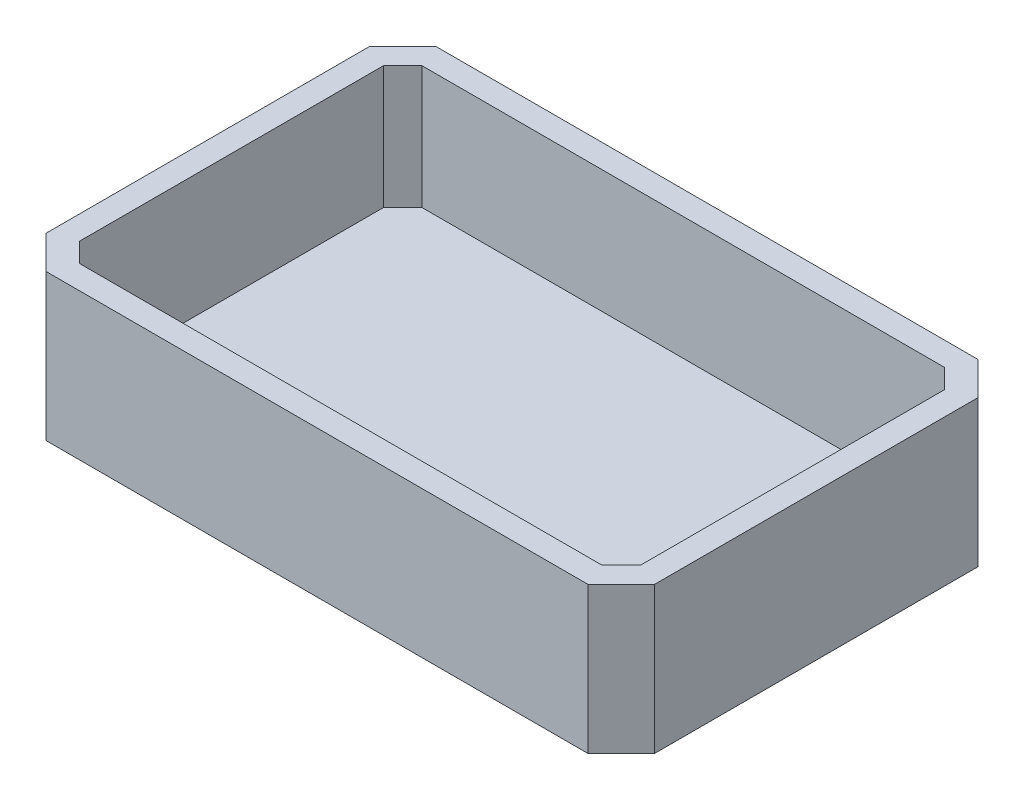
ISO-10303-21;
HEADER;
FILE_DESCRIPTION(('STEP AP214'),'2;1');
FILE_NAME('part.step','',(''),(''),'','','');
FILE_SCHEMA(('AUTOMOTIVE_DESIGN { 1 0 10303 214 1 1 1 1 }'));
ENDSEC;
DATA;
#1=APPLICATION_CONTEXT('core data for automotive mechanical design processes');
#2=APPLICATION_PROTOCOL_DEFINITION('international standard','automotive_design',2000,#1);
#3=PRODUCT_CONTEXT('',#1,'mechanical');
#4=PRODUCT('Part','Part','',(#3));
#5=PRODUCT_RELATED_PRODUCT_CATEGORY('part','',(#4));
#6=PRODUCT_DEFINITION_FORMATION('','',#4);
#7=PRODUCT_DEFINITION_CONTEXT('part definition',#1,'design');
#8=PRODUCT_DEFINITION('design','',#6,#7);
#9=PRODUCT_DEFINITION_SHAPE('','',#8);
#10=(LENGTH_UNIT() NAMED_UNIT(*) SI_UNIT(.MILLI.,.METRE.));
#11=(NAMED_UNIT(*) PLANE_ANGLE_UNIT() SI_UNIT($,.RADIAN.));
#12=(NAMED_UNIT(*) SI_UNIT($,.STERADIAN.) SOLID_ANGLE_UNIT());
#13=UNCERTAINTY_MEASURE_WITH_UNIT(LENGTH_MEASURE(1.E-05),#10,'distance_accuracy_value','');
#14=(GEOMETRIC_REPRESENTATION_CONTEXT(3) GLOBAL_UNCERTAINTY_ASSIGNED_CONTEXT((#13)) GLOBAL_UNIT_ASSIGNED_CONTEXT((#10,
#11,#12)) REPRESENTATION_CONTEXT('',''));
#15=CARTESIAN_POINT('',(0.,0.,0.));
#16=DIRECTION('',(0.,0.,1.));
#17=DIRECTION('',(1.,0.,0.));
#18=AXIS2_PLACEMENT_3D('',#15,#16,#17);
#19=CARTESIAN_POINT('',(0.,124.,0.));
#20=DIRECTION('',(0.,-1.,0.));
#21=DIRECTION('',(0.,0.,-1.));
#22=AXIS2_PLACEMENT_3D('',#19,#20,#21);
#23=PLANE('',#22);
#24=DIRECTION('',(1.,0.,0.));
#25=VECTOR('',#24,1.);
#26=CARTESIAN_POINT('',(-257.5,124.,165.));
#27=LINE('',#26,#25);
#28=CARTESIAN_POINT('',(-229.5,124.,165.));
#29=VERTEX_POINT('',#28);
#30=CARTESIAN_POINT('',(229.5,124.,165.));
#31=VERTEX_POINT('',#30);
#32=EDGE_CURVE('E214',#29,#31,#27,.T.);
#33=ORIENTED_EDGE('',*,*,#32,.T.);
#34=DIRECTION('',(-0.70710678118655,0.,0.707106781186545));
#35=VECTOR('',#34,1.);
#36=CARTESIAN_POINT('',(257.5,124.,137.));
#37=LINE('',#36,#35);
#38=CARTESIAN_POINT('',(257.5,124.,137.));
#39=VERTEX_POINT('',#38);
#40=EDGE_CURVE('E252',#31,#39,#37,.F.);
#41=ORIENTED_EDGE('',*,*,#40,.T.);
#42=DIRECTION('',(0.,0.,-1.));
#43=VECTOR('',#42,1.);
#44=CARTESIAN_POINT('',(257.5,124.,165.));
#45=LINE('',#44,#43);
#46=CARTESIAN_POINT('',(257.5,124.,-137.));
#47=VERTEX_POINT('',#46);
#48=EDGE_CURVE('E205',#39,#47,#45,.T.);
#49=ORIENTED_EDGE('',*,*,#48,.T.);
#50=DIRECTION('',(0.707106781186546,0.,0.707106781186549));
#51=VECTOR('',#50,1.);
#52=CARTESIAN_POINT('',(229.5,124.,-165.));
#53=LINE('',#52,#51);
#54=CARTESIAN_POINT('',(229.5,124.,-165.));
#55=VERTEX_POINT('',#54);
#56=EDGE_CURVE('E250',#47,#55,#53,.F.);
#57=ORIENTED_EDGE('',*,*,#56,.T.);
#58=DIRECTION('',(-1.,0.,0.));
#59=VECTOR('',#58,1.);
#60=CARTESIAN_POINT('',(-257.5,124.,-165.));
#61=LINE('',#60,#59);
#62=CARTESIAN_POINT('',(-229.5,124.,-165.));
#63=VERTEX_POINT('',#62);
#64=EDGE_CURVE('E208',#55,#63,#61,.T.);
#65=ORIENTED_EDGE('',*,*,#64,.T.);
#66=DIRECTION('',(0.707106781186549,0.,-0.707106781186546));
#67=VECTOR('',#66,1.);
#68=CARTESIAN_POINT('',(-257.5,124.,-137.));
#69=LINE('',#68,#67);
#70=CARTESIAN_POINT('',(-257.5,124.,-137.));
#71=VERTEX_POINT('',#70);
#72=EDGE_CURVE('E248',#63,#71,#69,.F.);
#73=ORIENTED_EDGE('',*,*,#72,.T.);
#74=DIRECTION('',(0.,0.,1.));
#75=VECTOR('',#74,1.);
#76=CARTESIAN_POINT('',(-257.5,124.,165.));
#77=LINE('',#76,#75);
#78=CARTESIAN_POINT('',(-257.5,124.,137.));
#79=VERTEX_POINT('',#78);
#80=EDGE_CURVE('E212',#71,#79,#77,.T.);
#81=ORIENTED_EDGE('',*,*,#80,.T.);
#82=DIRECTION('',(-0.707106781186546,0.,-0.707106781186549));
#83=VECTOR('',#82,1.);
#84=CARTESIAN_POINT('',(-229.5,124.,165.));
#85=LINE('',#84,#83);
#86=EDGE_CURVE('E246',#79,#29,#85,.F.);
#87=ORIENTED_EDGE('',*,*,#86,.T.);
#88=EDGE_LOOP('',(#33,#41,#49,#57,#65,#73,#81,#87));
#89=FACE_BOUND('',#88,.T.);
#90=DIRECTION('',(1.,0.,0.));
#91=VECTOR('',#90,1.);
#92=CARTESIAN_POINT('',(0.,124.,145.));
#93=LINE('',#92,#91);
#94=CARTESIAN_POINT('',(-221.215728752538,124.,145.));
#95=VERTEX_POINT('',#94);
#96=CARTESIAN_POINT('',(221.215728752538,124.,145.));
#97=VERTEX_POINT('',#96);
#98=EDGE_CURVE('E182',#95,#97,#93,.T.);
#99=ORIENTED_EDGE('',*,*,#98,.F.);
#100=DIRECTION('',(-0.707106781186546,0.,-0.707106781186549));
#101=VECTOR('',#100,1.);
#102=CARTESIAN_POINT('',(-215.357864376269,124.,150.857864376269));
#103=LINE('',#102,#101);
#104=CARTESIAN_POINT('',(-237.5,124.,128.715728752538));
#105=VERTEX_POINT('',#104);
#106=EDGE_CURVE('E184',#105,#95,#103,.F.);
#107=ORIENTED_EDGE('',*,*,#106,.F.);
#108=DIRECTION('',(0.,0.,1.));
#109=VECTOR('',#108,1.);
#110=CARTESIAN_POINT('',(-237.5,124.,0.));
#111=LINE('',#110,#109);
#112=CARTESIAN_POINT('',(-237.5,124.,-128.715728752538));
#113=VERTEX_POINT('',#112);
#114=EDGE_CURVE('E55',#113,#105,#111,.T.);
#115=ORIENTED_EDGE('',*,*,#114,.F.);
#116=DIRECTION('',(0.707106781186549,0.,-0.707106781186546));
#117=VECTOR('',#116,1.);
#118=CARTESIAN_POINT('',(-243.357864376269,124.,-122.857864376269));
#119=LINE('',#118,#117);
#120=CARTESIAN_POINT('',(-221.215728752538,124.,-145.));
#121=VERTEX_POINT('',#120);
#122=EDGE_CURVE('E186',#121,#113,#119,.F.);
#123=ORIENTED_EDGE('',*,*,#122,.F.);
#124=DIRECTION('',(-1.,0.,0.));
#125=VECTOR('',#124,1.);
#126=CARTESIAN_POINT('',(0.,124.,-145.));
#127=LINE('',#126,#125);
#128=CARTESIAN_POINT('',(221.215728752538,124.,-145.));
#129=VERTEX_POINT('',#128);
#130=EDGE_CURVE('E193',#129,#121,#127,.T.);
#131=ORIENTED_EDGE('',*,*,#130,.F.);
#132=DIRECTION('',(0.707106781186546,0.,0.707106781186549));
#133=VECTOR('',#132,1.);
#134=CARTESIAN_POINT('',(215.357864376269,124.,-150.857864376269));
#135=LINE('',#134,#133);
#136=CARTESIAN_POINT('',(237.5,124.,-128.715728752538));
#137=VERTEX_POINT('',#136);
#138=EDGE_CURVE('E194',#137,#129,#135,.F.);
#139=ORIENTED_EDGE('',*,*,#138,.F.);
#140=DIRECTION('',(0.,0.,-1.));
#141=VECTOR('',#140,1.);
#142=CARTESIAN_POINT('',(237.5,124.,0.));
#143=LINE('',#142,#141);
#144=CARTESIAN_POINT('',(237.5,124.,128.715728752538));
#145=VERTEX_POINT('',#144);
#146=EDGE_CURVE('E177',#145,#137,#143,.T.);
#147=ORIENTED_EDGE('',*,*,#146,.F.);
#148=DIRECTION('',(-0.70710678118655,0.,0.707106781186545));
#149=VECTOR('',#148,1.);
#150=CARTESIAN_POINT('',(243.357864376269,124.,122.857864376269));
#151=LINE('',#150,#149);
#152=EDGE_CURVE('E196',#97,#145,#151,.F.);
#153=ORIENTED_EDGE('',*,*,#152,.F.);
#154=EDGE_LOOP('',(#99,#107,#115,#123,#131,#139,#147,#153));
#155=FACE_BOUND('',#154,.T.);
#156=ADVANCED_FACE('F39',(#89,#155),#23,.F.);
#157=CARTESIAN_POINT('',(257.5,124.,165.));
#158=DIRECTION('',(-1.,0.,0.));
#159=DIRECTION('',(0.,0.,1.));
#160=AXIS2_PLACEMENT_3D('',#157,#158,#159);
#161=PLANE('',#160);
#162=ORIENTED_EDGE('',*,*,#48,.F.);
#163=DIRECTION('',(0.,-1.,0.));
#164=VECTOR('',#163,1.);
#165=CARTESIAN_POINT('',(257.5,124.,137.));
#166=LINE('',#165,#164);
#167=CARTESIAN_POINT('',(257.5,0.,137.));
#168=VERTEX_POINT('',#167);
#169=EDGE_CURVE('E230',#39,#168,#166,.T.);
#170=ORIENTED_EDGE('',*,*,#169,.T.);
#171=DIRECTION('',(0.,0.,-1.));
#172=VECTOR('',#171,1.);
#173=CARTESIAN_POINT('',(257.5,0.,165.));
#174=LINE('',#173,#172);
#175=CARTESIAN_POINT('',(257.5,0.,-137.));
#176=VERTEX_POINT('',#175);
#177=EDGE_CURVE('E218',#168,#176,#174,.T.);
#178=ORIENTED_EDGE('',*,*,#177,.T.);
#179=DIRECTION('',(0.,1.,0.));
#180=VECTOR('',#179,1.);
#181=CARTESIAN_POINT('',(257.5,124.,-137.));
#182=LINE('',#181,#180);
#183=EDGE_CURVE('E217',#176,#47,#182,.T.);
#184=ORIENTED_EDGE('',*,*,#183,.T.);
#185=EDGE_LOOP('',(#162,#170,#178,#184));
#186=FACE_BOUND('',#185,.T.);
#187=ADVANCED_FACE('F291',(#186),#161,.F.);
#188=CARTESIAN_POINT('',(-257.5,124.,-165.));
#189=DIRECTION('',(0.,0.,1.));
#190=DIRECTION('',(1.,0.,0.));
#191=AXIS2_PLACEMENT_3D('',#188,#189,#190);
#192=PLANE('',#191);
#193=ORIENTED_EDGE('',*,*,#64,.F.);
#194=DIRECTION('',(0.,-1.,0.));
#195=VECTOR('',#194,1.);
#196=CARTESIAN_POINT('',(229.5,124.,-165.));
#197=LINE('',#196,#195);
#198=CARTESIAN_POINT('',(229.5,0.,-165.));
#199=VERTEX_POINT('',#198);
#200=EDGE_CURVE('E256',#55,#199,#197,.T.);
#201=ORIENTED_EDGE('',*,*,#200,.T.);
#202=DIRECTION('',(-1.,0.,0.));
#203=VECTOR('',#202,1.);
#204=CARTESIAN_POINT('',(-257.5,0.,-165.));
#205=LINE('',#204,#203);
#206=CARTESIAN_POINT('',(-229.5,0.,-165.));
#207=VERTEX_POINT('',#206);
#208=EDGE_CURVE('E221',#199,#207,#205,.T.);
#209=ORIENTED_EDGE('',*,*,#208,.T.);
#210=DIRECTION('',(0.,1.,0.));
#211=VECTOR('',#210,1.);
#212=CARTESIAN_POINT('',(-229.5,124.,-165.));
#213=LINE('',#212,#211);
#214=EDGE_CURVE('E254',#207,#63,#213,.T.);
#215=ORIENTED_EDGE('',*,*,#214,.T.);
#216=EDGE_LOOP('',(#193,#201,#209,#215));
#217=FACE_BOUND('',#216,.T.);
#218=ADVANCED_FACE('F262',(#217),#192,.F.);
#219=CARTESIAN_POINT('',(-257.5,124.,165.));
#220=DIRECTION('',(1.,0.,0.));
#221=DIRECTION('',(0.,0.,-1.));
#222=AXIS2_PLACEMENT_3D('',#219,#220,#221);
#223=PLANE('',#222);
#224=ORIENTED_EDGE('',*,*,#80,.F.);
#225=DIRECTION('',(0.,-1.,0.));
#226=VECTOR('',#225,1.);
#227=CARTESIAN_POINT('',(-257.5,124.,-137.));
#228=LINE('',#227,#226);
#229=CARTESIAN_POINT('',(-257.5,0.,-137.));
#230=VERTEX_POINT('',#229);
#231=EDGE_CURVE('E11',#71,#230,#228,.T.);
#232=ORIENTED_EDGE('',*,*,#231,.T.);
#233=DIRECTION('',(0.,0.,1.));
#234=VECTOR('',#233,1.);
#235=CARTESIAN_POINT('',(-257.5,0.,165.));
#236=LINE('',#235,#234);
#237=CARTESIAN_POINT('',(-257.5,0.,137.));
#238=VERTEX_POINT('',#237);
#239=EDGE_CURVE('E225',#230,#238,#236,.T.);
#240=ORIENTED_EDGE('',*,*,#239,.T.);
#241=DIRECTION('',(0.,1.,0.));
#242=VECTOR('',#241,1.);
#243=CARTESIAN_POINT('',(-257.5,124.,137.));
#244=LINE('',#243,#242);
#245=EDGE_CURVE('E48',#238,#79,#244,.T.);
#246=ORIENTED_EDGE('',*,*,#245,.T.);
#247=EDGE_LOOP('',(#224,#232,#240,#246));
#248=FACE_BOUND('',#247,.T.);
#249=ADVANCED_FACE('F274',(#248),#223,.F.);
#250=CARTESIAN_POINT('',(-257.5,124.,165.));
#251=DIRECTION('',(0.,0.,-1.));
#252=DIRECTION('',(-1.,0.,0.));
#253=AXIS2_PLACEMENT_3D('',#250,#251,#252);
#254=PLANE('',#253);
#255=DIRECTION('',(1.,0.,0.));
#256=VECTOR('',#255,1.);
#257=CARTESIAN_POINT('',(-257.5,0.,165.));
#258=LINE('',#257,#256);
#259=CARTESIAN_POINT('',(-229.5,0.,165.));
#260=VERTEX_POINT('',#259);
#261=CARTESIAN_POINT('',(229.5,0.,165.));
#262=VERTEX_POINT('',#261);
#263=EDGE_CURVE('E209',#260,#262,#258,.T.);
#264=ORIENTED_EDGE('',*,*,#263,.T.);
#265=DIRECTION('',(0.,1.,0.));
#266=VECTOR('',#265,1.);
#267=CARTESIAN_POINT('',(229.5,124.,165.));
#268=LINE('',#267,#266);
#269=EDGE_CURVE('E244',#262,#31,#268,.T.);
#270=ORIENTED_EDGE('',*,*,#269,.T.);
#271=ORIENTED_EDGE('',*,*,#32,.F.);
#272=DIRECTION('',(0.,-1.,0.));
#273=VECTOR('',#272,1.);
#274=CARTESIAN_POINT('',(-229.5,124.,165.));
#275=LINE('',#274,#273);
#276=EDGE_CURVE('E241',#29,#260,#275,.T.);
#277=ORIENTED_EDGE('',*,*,#276,.T.);
#278=EDGE_LOOP('',(#264,#270,#271,#277));
#279=FACE_BOUND('',#278,.T.);
#280=ADVANCED_FACE('F283',(#279),#254,.F.);
#281=CARTESIAN_POINT('',(0.,0.,0.));
#282=DIRECTION('',(0.,-1.,0.));
#283=DIRECTION('',(0.,0.,-1.));
#284=AXIS2_PLACEMENT_3D('',#281,#282,#283);
#285=PLANE('',#284);
#286=ORIENTED_EDGE('',*,*,#177,.F.);
#287=DIRECTION('',(0.70710678118655,0.,-0.707106781186545));
#288=VECTOR('',#287,1.);
#289=CARTESIAN_POINT('',(197.249999999999,0.,197.25));
#290=LINE('',#289,#288);
#291=EDGE_CURVE('E239',#168,#262,#290,.F.);
#292=ORIENTED_EDGE('',*,*,#291,.T.);
#293=ORIENTED_EDGE('',*,*,#263,.F.);
#294=DIRECTION('',(0.707106781186546,0.,0.707106781186549));
#295=VECTOR('',#294,1.);
#296=CARTESIAN_POINT('',(-197.250000000001,0.,197.25));
#297=LINE('',#296,#295);
#298=EDGE_CURVE('E233',#260,#238,#297,.F.);
#299=ORIENTED_EDGE('',*,*,#298,.T.);
#300=ORIENTED_EDGE('',*,*,#239,.F.);
#301=DIRECTION('',(-0.707106781186549,0.,0.707106781186546));
#302=VECTOR('',#301,1.);
#303=CARTESIAN_POINT('',(-197.249999999999,0.,-197.25));
#304=LINE('',#303,#302);
#305=EDGE_CURVE('E235',#230,#207,#304,.F.);
#306=ORIENTED_EDGE('',*,*,#305,.T.);
#307=ORIENTED_EDGE('',*,*,#208,.F.);
#308=DIRECTION('',(-0.707106781186546,0.,-0.707106781186549));
#309=VECTOR('',#308,1.);
#310=CARTESIAN_POINT('',(197.25,0.,-197.25));
#311=LINE('',#310,#309);
#312=EDGE_CURVE('E237',#199,#176,#311,.F.);
#313=ORIENTED_EDGE('',*,*,#312,.T.);
#314=EDGE_LOOP('',(#286,#292,#293,#299,#300,#306,#307,#313));
#315=FACE_BOUND('',#314,.T.);
#316=ADVANCED_FACE('F268',(#315),#285,.T.);
#317=CARTESIAN_POINT('',(257.5,124.,137.));
#318=DIRECTION('',(-0.707106781186545,0.,-0.70710678118655));
#319=DIRECTION('',(0.,-1.,0.));
#320=AXIS2_PLACEMENT_3D('',#317,#318,#319);
#321=PLANE('',#320);
#322=ORIENTED_EDGE('',*,*,#40,.F.);
#323=ORIENTED_EDGE('',*,*,#269,.F.);
#324=ORIENTED_EDGE('',*,*,#291,.F.);
#325=ORIENTED_EDGE('',*,*,#169,.F.);
#326=EDGE_LOOP('',(#322,#323,#324,#325));
#327=FACE_BOUND('',#326,.T.);
#328=ADVANCED_FACE('F288',(#327),#321,.F.);
#329=CARTESIAN_POINT('',(229.5,124.,-165.));
#330=DIRECTION('',(-0.707106781186549,0.,0.707106781186546));
#331=DIRECTION('',(0.,-1.,0.));
#332=AXIS2_PLACEMENT_3D('',#329,#330,#331);
#333=PLANE('',#332);
#334=ORIENTED_EDGE('',*,*,#56,.F.);
#335=ORIENTED_EDGE('',*,*,#183,.F.);
#336=ORIENTED_EDGE('',*,*,#312,.F.);
#337=ORIENTED_EDGE('',*,*,#200,.F.);
#338=EDGE_LOOP('',(#334,#335,#336,#337));
#339=FACE_BOUND('',#338,.T.);
#340=ADVANCED_FACE('F293',(#339),#333,.F.);
#341=CARTESIAN_POINT('',(-257.5,124.,-137.));
#342=DIRECTION('',(0.707106781186546,0.,0.707106781186549));
#343=DIRECTION('',(0.,-1.,0.));
#344=AXIS2_PLACEMENT_3D('',#341,#342,#343);
#345=PLANE('',#344);
#346=ORIENTED_EDGE('',*,*,#72,.F.);
#347=ORIENTED_EDGE('',*,*,#214,.F.);
#348=ORIENTED_EDGE('',*,*,#305,.F.);
#349=ORIENTED_EDGE('',*,*,#231,.F.);
#350=EDGE_LOOP('',(#346,#347,#348,#349));
#351=FACE_BOUND('',#350,.T.);
#352=ADVANCED_FACE('F273',(#351),#345,.F.);
#353=CARTESIAN_POINT('',(-229.5,124.,165.));
#354=DIRECTION('',(0.707106781186549,0.,-0.707106781186546));
#355=DIRECTION('',(0.,-1.,0.));
#356=AXIS2_PLACEMENT_3D('',#353,#354,#355);
#357=PLANE('',#356);
#358=ORIENTED_EDGE('',*,*,#86,.F.);
#359=ORIENTED_EDGE('',*,*,#245,.F.);
#360=ORIENTED_EDGE('',*,*,#298,.F.);
#361=ORIENTED_EDGE('',*,*,#276,.F.);
#362=EDGE_LOOP('',(#358,#359,#360,#361));
#363=FACE_BOUND('',#362,.T.);
#364=ADVANCED_FACE('F42',(#363),#357,.F.);
#365=CARTESIAN_POINT('',(237.5,124.,165.));
#366=DIRECTION('',(-1.,0.,0.));
#367=DIRECTION('',(0.,0.,1.));
#368=AXIS2_PLACEMENT_3D('',#365,#366,#367);
#369=PLANE('',#368);
#370=ORIENTED_EDGE('',*,*,#146,.T.);
#371=DIRECTION('',(0.,-1.,0.));
#372=VECTOR('',#371,1.);
#373=CARTESIAN_POINT('',(237.5,124.,-128.715728752538));
#374=LINE('',#373,#372);
#375=CARTESIAN_POINT('',(237.5,20.,-128.715728752538));
#376=VERTEX_POINT('',#375);
#377=EDGE_CURVE('E202',#376,#137,#374,.F.);
#378=ORIENTED_EDGE('',*,*,#377,.F.);
#379=DIRECTION('',(0.,0.,-1.));
#380=VECTOR('',#379,1.);
#381=CARTESIAN_POINT('',(237.5,20.,0.));
#382=LINE('',#381,#380);
#383=CARTESIAN_POINT('',(237.5,20.,128.715728752538));
#384=VERTEX_POINT('',#383);
#385=EDGE_CURVE('E481',#384,#376,#382,.T.);
#386=ORIENTED_EDGE('',*,*,#385,.F.);
#387=DIRECTION('',(0.,1.,0.));
#388=VECTOR('',#387,1.);
#389=CARTESIAN_POINT('',(237.5,124.,128.715728752538));
#390=LINE('',#389,#388);
#391=EDGE_CURVE('E162',#145,#384,#390,.F.);
#392=ORIENTED_EDGE('',*,*,#391,.F.);
#393=EDGE_LOOP('',(#370,#378,#386,#392));
#394=FACE_BOUND('',#393,.T.);
#395=ADVANCED_FACE('F370',(#394),#369,.T.);
#396=CARTESIAN_POINT('',(-257.5,124.,-145.));
#397=DIRECTION('',(0.,0.,1.));
#398=DIRECTION('',(1.,0.,0.));
#399=AXIS2_PLACEMENT_3D('',#396,#397,#398);
#400=PLANE('',#399);
#401=ORIENTED_EDGE('',*,*,#130,.T.);
#402=DIRECTION('',(0.,-1.,0.));
#403=VECTOR('',#402,1.);
#404=CARTESIAN_POINT('',(-221.215728752538,124.,-145.));
#405=LINE('',#404,#403);
#406=CARTESIAN_POINT('',(-221.215728752538,20.,-145.));
#407=VERTEX_POINT('',#406);
#408=EDGE_CURVE('E204',#407,#121,#405,.F.);
#409=ORIENTED_EDGE('',*,*,#408,.F.);
#410=DIRECTION('',(-1.,0.,0.));
#411=VECTOR('',#410,1.);
#412=CARTESIAN_POINT('',(0.,20.,-145.));
#413=LINE('',#412,#411);
#414=CARTESIAN_POINT('',(221.215728752538,20.,-145.));
#415=VERTEX_POINT('',#414);
#416=EDGE_CURVE('E487',#415,#407,#413,.T.);
#417=ORIENTED_EDGE('',*,*,#416,.F.);
#418=DIRECTION('',(0.,1.,0.));
#419=VECTOR('',#418,1.);
#420=CARTESIAN_POINT('',(221.215728752538,124.,-145.));
#421=LINE('',#420,#419);
#422=EDGE_CURVE('E494',#129,#415,#421,.F.);
#423=ORIENTED_EDGE('',*,*,#422,.F.);
#424=EDGE_LOOP('',(#401,#409,#417,#423));
#425=FACE_BOUND('',#424,.T.);
#426=ADVANCED_FACE('F385',(#425),#400,.T.);
#427=CARTESIAN_POINT('',(-237.5,124.,165.));
#428=DIRECTION('',(1.,0.,0.));
#429=DIRECTION('',(0.,0.,-1.));
#430=AXIS2_PLACEMENT_3D('',#427,#428,#429);
#431=PLANE('',#430);
#432=ORIENTED_EDGE('',*,*,#114,.T.);
#433=DIRECTION('',(0.,-1.,0.));
#434=VECTOR('',#433,1.);
#435=CARTESIAN_POINT('',(-237.5,124.,128.715728752538));
#436=LINE('',#435,#434);
#437=CARTESIAN_POINT('',(-237.5,20.,128.715728752538));
#438=VERTEX_POINT('',#437);
#439=EDGE_CURVE('E477',#438,#105,#436,.F.);
#440=ORIENTED_EDGE('',*,*,#439,.F.);
#441=DIRECTION('',(0.,0.,1.));
#442=VECTOR('',#441,1.);
#443=CARTESIAN_POINT('',(-237.5,20.,0.));
#444=LINE('',#443,#442);
#445=CARTESIAN_POINT('',(-237.5,20.,-128.715728752538));
#446=VERTEX_POINT('',#445);
#447=EDGE_CURVE('E178',#446,#438,#444,.T.);
#448=ORIENTED_EDGE('',*,*,#447,.F.);
#449=DIRECTION('',(0.,1.,0.));
#450=VECTOR('',#449,1.);
#451=CARTESIAN_POINT('',(-237.5,124.,-128.715728752538));
#452=LINE('',#451,#450);
#453=EDGE_CURVE('E222',#113,#446,#452,.F.);
#454=ORIENTED_EDGE('',*,*,#453,.F.);
#455=EDGE_LOOP('',(#432,#440,#448,#454));
#456=FACE_BOUND('',#455,.T.);
#457=ADVANCED_FACE('F395',(#456),#431,.T.);
#458=CARTESIAN_POINT('',(-257.5,124.,145.));
#459=DIRECTION('',(0.,0.,-1.));
#460=DIRECTION('',(-1.,0.,0.));
#461=AXIS2_PLACEMENT_3D('',#458,#459,#460);
#462=PLANE('',#461);
#463=DIRECTION('',(1.,0.,0.));
#464=VECTOR('',#463,1.);
#465=CARTESIAN_POINT('',(0.,20.,145.));
#466=LINE('',#465,#464);
#467=CARTESIAN_POINT('',(-221.215728752538,20.,145.));
#468=VERTEX_POINT('',#467);
#469=CARTESIAN_POINT('',(221.215728752538,20.,145.));
#470=VERTEX_POINT('',#469);
#471=EDGE_CURVE('E170',#468,#470,#466,.T.);
#472=ORIENTED_EDGE('',*,*,#471,.F.);
#473=DIRECTION('',(0.,1.,0.));
#474=VECTOR('',#473,1.);
#475=CARTESIAN_POINT('',(-221.215728752538,124.,145.));
#476=LINE('',#475,#474);
#477=EDGE_CURVE('E166',#95,#468,#476,.F.);
#478=ORIENTED_EDGE('',*,*,#477,.F.);
#479=ORIENTED_EDGE('',*,*,#98,.T.);
#480=DIRECTION('',(0.,-1.,0.));
#481=VECTOR('',#480,1.);
#482=CARTESIAN_POINT('',(221.215728752538,124.,145.));
#483=LINE('',#482,#481);
#484=EDGE_CURVE('E159',#470,#97,#483,.F.);
#485=ORIENTED_EDGE('',*,*,#484,.F.);
#486=EDGE_LOOP('',(#472,#478,#479,#485));
#487=FACE_BOUND('',#486,.T.);
#488=ADVANCED_FACE('F180',(#487),#462,.T.);
#489=CARTESIAN_POINT('',(0.,20.,0.));
#490=DIRECTION('',(0.,-1.,0.));
#491=DIRECTION('',(0.,0.,-1.));
#492=AXIS2_PLACEMENT_3D('',#489,#490,#491);
#493=PLANE('',#492);
#494=ORIENTED_EDGE('',*,*,#385,.T.);
#495=DIRECTION('',(-0.707106781186546,0.,-0.707106781186549));
#496=VECTOR('',#495,1.);
#497=CARTESIAN_POINT('',(183.107864376269,20.,-183.107864376269));
#498=LINE('',#497,#496);
#499=EDGE_CURVE('E167',#415,#376,#498,.F.);
#500=ORIENTED_EDGE('',*,*,#499,.F.);
#501=ORIENTED_EDGE('',*,*,#416,.T.);
#502=DIRECTION('',(-0.707106781186549,0.,0.707106781186546));
#503=VECTOR('',#502,1.);
#504=CARTESIAN_POINT('',(-183.107864376269,20.,-183.107864376269));
#505=LINE('',#504,#503);
#506=EDGE_CURVE('E483',#446,#407,#505,.F.);
#507=ORIENTED_EDGE('',*,*,#506,.F.);
#508=ORIENTED_EDGE('',*,*,#447,.T.);
#509=DIRECTION('',(0.707106781186546,0.,0.707106781186549));
#510=VECTOR('',#509,1.);
#511=CARTESIAN_POINT('',(-183.10786437627,20.,183.107864376269));
#512=LINE('',#511,#510);
#513=EDGE_CURVE('E173',#468,#438,#512,.F.);
#514=ORIENTED_EDGE('',*,*,#513,.F.);
#515=ORIENTED_EDGE('',*,*,#471,.T.);
#516=DIRECTION('',(0.70710678118655,0.,-0.707106781186545));
#517=VECTOR('',#516,1.);
#518=CARTESIAN_POINT('',(183.107864376268,20.,183.107864376269));
#519=LINE('',#518,#517);
#520=EDGE_CURVE('E155',#384,#470,#519,.F.);
#521=ORIENTED_EDGE('',*,*,#520,.F.);
#522=EDGE_LOOP('',(#494,#500,#501,#507,#508,#514,#515,#521));
#523=FACE_BOUND('',#522,.T.);
#524=ADVANCED_FACE('F171',(#523),#493,.F.);
#525=CARTESIAN_POINT('',(243.357864376269,124.,122.857864376269));
#526=DIRECTION('',(-0.707106781186545,0.,-0.70710678118655));
#527=DIRECTION('',(0.,-1.,0.));
#528=AXIS2_PLACEMENT_3D('',#525,#526,#527);
#529=PLANE('',#528);
#530=ORIENTED_EDGE('',*,*,#152,.T.);
#531=ORIENTED_EDGE('',*,*,#391,.T.);
#532=ORIENTED_EDGE('',*,*,#520,.T.);
#533=ORIENTED_EDGE('',*,*,#484,.T.);
#534=EDGE_LOOP('',(#530,#531,#532,#533));
#535=FACE_BOUND('',#534,.T.);
#536=ADVANCED_FACE('F157',(#535),#529,.T.);
#537=CARTESIAN_POINT('',(215.357864376269,124.,-150.857864376269));
#538=DIRECTION('',(-0.707106781186549,0.,0.707106781186546));
#539=DIRECTION('',(0.,-1.,0.));
#540=AXIS2_PLACEMENT_3D('',#537,#538,#539);
#541=PLANE('',#540);
#542=ORIENTED_EDGE('',*,*,#138,.T.);
#543=ORIENTED_EDGE('',*,*,#422,.T.);
#544=ORIENTED_EDGE('',*,*,#499,.T.);
#545=ORIENTED_EDGE('',*,*,#377,.T.);
#546=EDGE_LOOP('',(#542,#543,#544,#545));
#547=FACE_BOUND('',#546,.T.);
#548=ADVANCED_FACE('F433',(#547),#541,.T.);
#549=CARTESIAN_POINT('',(-243.357864376269,124.,-122.857864376269));
#550=DIRECTION('',(0.707106781186546,0.,0.707106781186549));
#551=DIRECTION('',(0.,-1.,0.));
#552=AXIS2_PLACEMENT_3D('',#549,#550,#551);
#553=PLANE('',#552);
#554=ORIENTED_EDGE('',*,*,#122,.T.);
#555=ORIENTED_EDGE('',*,*,#453,.T.);
#556=ORIENTED_EDGE('',*,*,#506,.T.);
#557=ORIENTED_EDGE('',*,*,#408,.T.);
#558=EDGE_LOOP('',(#554,#555,#556,#557));
#559=FACE_BOUND('',#558,.T.);
#560=ADVANCED_FACE('F443',(#559),#553,.T.);
#561=CARTESIAN_POINT('',(-215.357864376269,124.,150.857864376269));
#562=DIRECTION('',(0.707106781186549,0.,-0.707106781186546));
#563=DIRECTION('',(0.,-1.,0.));
#564=AXIS2_PLACEMENT_3D('',#561,#562,#563);
#565=PLANE('',#564);
#566=ORIENTED_EDGE('',*,*,#106,.T.);
#567=ORIENTED_EDGE('',*,*,#477,.T.);
#568=ORIENTED_EDGE('',*,*,#513,.T.);
#569=ORIENTED_EDGE('',*,*,#439,.T.);
#570=EDGE_LOOP('',(#566,#567,#568,#569));
#571=FACE_BOUND('',#570,.T.);
#572=ADVANCED_FACE('F310',(#571),#565,.T.);
#573=CLOSED_SHELL('',(#156,#187,#218,#249,#280,#316,#328,#340,#352,#364,#395,#426,#457,#488,
#524,#536,#548,#560,#572));
#574=MANIFOLD_SOLID_BREP('B2',#573);
#575=ADVANCED_BREP_SHAPE_REPRESENTATION('',(#18,#574),#14);
#576=SHAPE_DEFINITION_REPRESENTATION(#9,#575);
ENDSEC;
END-ISO-10303-21;
